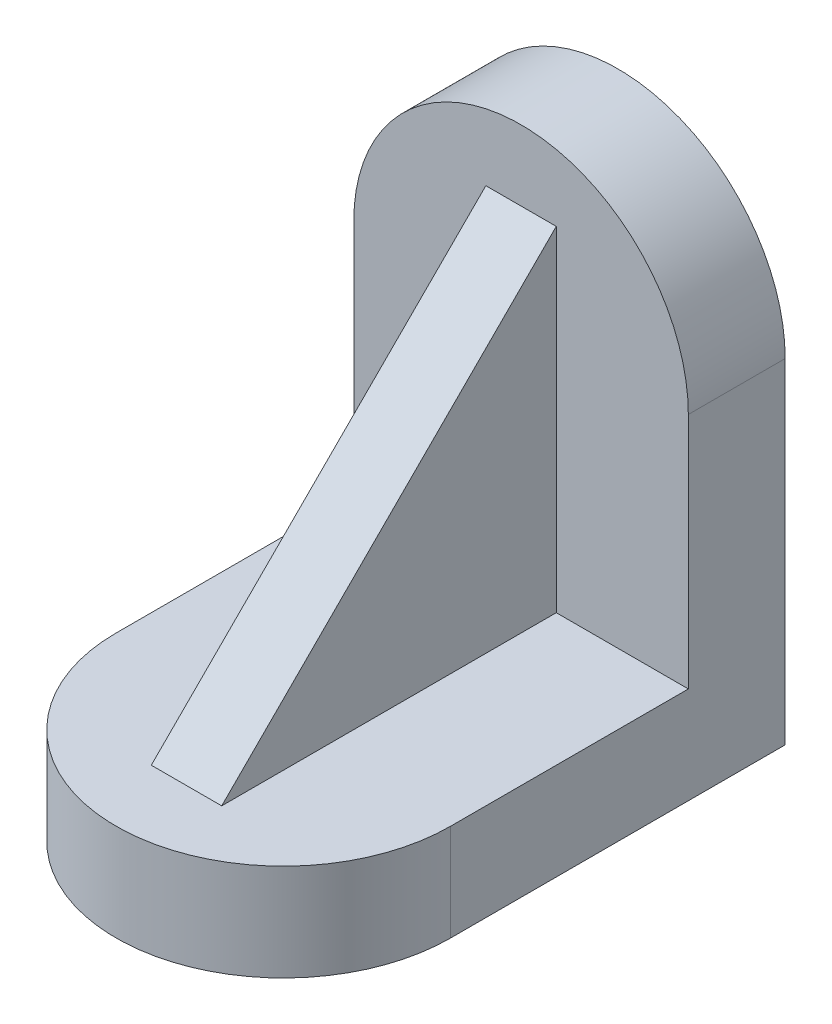
ISO-10303-21;
HEADER;
FILE_DESCRIPTION(('STEP AP214'),'2;1');
FILE_NAME('part.step','',(''),(''),'','','');
FILE_SCHEMA(('AUTOMOTIVE_DESIGN { 1 0 10303 214 1 1 1 1 }'));
ENDSEC;
DATA;
#1=APPLICATION_CONTEXT('core data for automotive mechanical design processes');
#2=APPLICATION_PROTOCOL_DEFINITION('international standard','automotive_design',2000,#1);
#3=PRODUCT_CONTEXT('',#1,'mechanical');
#4=PRODUCT('Part','Part','',(#3));
#5=PRODUCT_RELATED_PRODUCT_CATEGORY('part','',(#4));
#6=PRODUCT_DEFINITION_FORMATION('','',#4);
#7=PRODUCT_DEFINITION_CONTEXT('part definition',#1,'design');
#8=PRODUCT_DEFINITION('design','',#6,#7);
#9=PRODUCT_DEFINITION_SHAPE('','',#8);
#10=(LENGTH_UNIT() NAMED_UNIT(*) SI_UNIT(.MILLI.,.METRE.));
#11=(NAMED_UNIT(*) PLANE_ANGLE_UNIT() SI_UNIT($,.RADIAN.));
#12=(NAMED_UNIT(*) SI_UNIT($,.STERADIAN.) SOLID_ANGLE_UNIT());
#13=UNCERTAINTY_MEASURE_WITH_UNIT(LENGTH_MEASURE(1.E-05),#10,'distance_accuracy_value','');
#14=(GEOMETRIC_REPRESENTATION_CONTEXT(3) GLOBAL_UNCERTAINTY_ASSIGNED_CONTEXT((#13)) GLOBAL_UNIT_ASSIGNED_CONTEXT((#10,
#11,#12)) REPRESENTATION_CONTEXT('',''));
#15=CARTESIAN_POINT('',(0.,0.,0.));
#16=DIRECTION('',(0.,0.,1.));
#17=DIRECTION('',(1.,0.,0.));
#18=AXIS2_PLACEMENT_3D('',#15,#16,#17);
#19=CARTESIAN_POINT('',(19.,11.,0.));
#20=DIRECTION('',(0.,1.,0.));
#21=DIRECTION('',(0.,0.,1.));
#22=AXIS2_PLACEMENT_3D('',#19,#20,#21);
#23=PLANE('',#22);
#24=DIRECTION('',(0.,0.,1.));
#25=VECTOR('',#24,1.);
#26=CARTESIAN_POINT('',(15.,11.,0.));
#27=LINE('',#26,#25);
#28=CARTESIAN_POINT('',(15.,11.,-27.));
#29=VERTEX_POINT('',#28);
#30=CARTESIAN_POINT('',(15.,11.,11.));
#31=VERTEX_POINT('',#30);
#32=EDGE_CURVE('E125',#29,#31,#27,.T.);
#33=ORIENTED_EDGE('',*,*,#32,.F.);
#34=DIRECTION('',(-1.,0.,0.));
#35=VECTOR('',#34,1.);
#36=CARTESIAN_POINT('',(19.,11.,-27.));
#37=LINE('',#36,#35);
#38=CARTESIAN_POINT('',(0.,11.,-27.));
#39=VERTEX_POINT('',#38);
#40=EDGE_CURVE('E142',#29,#39,#37,.T.);
#41=ORIENTED_EDGE('',*,*,#40,.T.);
#42=DIRECTION('',(0.,0.,1.));
#43=VECTOR('',#42,1.);
#44=CARTESIAN_POINT('',(0.,11.,0.));
#45=LINE('',#44,#43);
#46=CARTESIAN_POINT('',(0.,11.,0.));
#47=VERTEX_POINT('',#46);
#48=EDGE_CURVE('E154',#39,#47,#45,.T.);
#49=ORIENTED_EDGE('',*,*,#48,.T.);
#50=CARTESIAN_POINT('',(19.,11.,0.));
#51=DIRECTION('',(0.,1.,0.));
#52=DIRECTION('',(0.,0.,1.));
#53=AXIS2_PLACEMENT_3D('',#50,#51,#52);
#54=CIRCLE('',#53,19.);
#55=CARTESIAN_POINT('',(38.,11.,0.));
#56=VERTEX_POINT('',#55);
#57=EDGE_CURVE('E148',#47,#56,#54,.T.);
#58=ORIENTED_EDGE('',*,*,#57,.T.);
#59=DIRECTION('',(0.,0.,-1.));
#60=VECTOR('',#59,1.);
#61=CARTESIAN_POINT('',(38.,11.,0.));
#62=LINE('',#61,#60);
#63=CARTESIAN_POINT('',(38.,11.,-27.));
#64=VERTEX_POINT('',#63);
#65=EDGE_CURVE('E151',#56,#64,#62,.T.);
#66=ORIENTED_EDGE('',*,*,#65,.T.);
#67=CARTESIAN_POINT('',(23.,11.,-27.));
#68=VERTEX_POINT('',#67);
#69=EDGE_CURVE('E145',#64,#68,#37,.T.);
#70=ORIENTED_EDGE('',*,*,#69,.T.);
#71=DIRECTION('',(0.,0.,1.));
#72=VECTOR('',#71,1.);
#73=CARTESIAN_POINT('',(23.,11.,0.));
#74=LINE('',#73,#72);
#75=CARTESIAN_POINT('',(23.,11.,11.));
#76=VERTEX_POINT('',#75);
#77=EDGE_CURVE('E55',#68,#76,#74,.T.);
#78=ORIENTED_EDGE('',*,*,#77,.T.);
#79=DIRECTION('',(-1.,0.,0.));
#80=VECTOR('',#79,1.);
#81=CARTESIAN_POINT('',(19.,11.,11.));
#82=LINE('',#81,#80);
#83=EDGE_CURVE('E50',#31,#76,#82,.F.);
#84=ORIENTED_EDGE('',*,*,#83,.F.);
#85=EDGE_LOOP('',(#33,#41,#49,#58,#66,#70,#78,#84));
#86=FACE_BOUND('',#85,.T.);
#87=ADVANCED_FACE('F35',(#86),#23,.T.);
#88=CARTESIAN_POINT('',(19.,11.,0.));
#89=DIRECTION('',(0.,-1.,0.));
#90=DIRECTION('',(0.,0.,-1.));
#91=AXIS2_PLACEMENT_3D('',#88,#89,#90);
#92=CYLINDRICAL_SURFACE('',#91,19.);
#93=CARTESIAN_POINT('',(19.,0.,0.));
#94=DIRECTION('',(0.,1.,0.));
#95=DIRECTION('',(0.,0.,1.));
#96=AXIS2_PLACEMENT_3D('',#93,#94,#95);
#97=CIRCLE('',#96,19.);
#98=CARTESIAN_POINT('',(0.,0.,0.));
#99=VERTEX_POINT('',#98);
#100=CARTESIAN_POINT('',(38.,0.,0.));
#101=VERTEX_POINT('',#100);
#102=EDGE_CURVE('E147',#99,#101,#97,.T.);
#103=ORIENTED_EDGE('',*,*,#102,.T.);
#104=DIRECTION('',(0.,-1.,0.));
#105=VECTOR('',#104,1.);
#106=CARTESIAN_POINT('',(38.,11.,0.));
#107=LINE('',#106,#105);
#108=EDGE_CURVE('E117',#56,#101,#107,.T.);
#109=ORIENTED_EDGE('',*,*,#108,.F.);
#110=ORIENTED_EDGE('',*,*,#57,.F.);
#111=DIRECTION('',(0.,-1.,0.));
#112=VECTOR('',#111,1.);
#113=CARTESIAN_POINT('',(0.,11.,0.));
#114=LINE('',#113,#112);
#115=EDGE_CURVE('E156',#47,#99,#114,.T.);
#116=ORIENTED_EDGE('',*,*,#115,.T.);
#117=EDGE_LOOP('',(#103,#109,#110,#116));
#118=FACE_BOUND('',#117,.T.);
#119=ADVANCED_FACE('F37',(#118),#92,.T.);
#120=CARTESIAN_POINT('',(38.,11.,0.));
#121=DIRECTION('',(-1.,0.,0.));
#122=DIRECTION('',(0.,0.,1.));
#123=AXIS2_PLACEMENT_3D('',#120,#121,#122);
#124=PLANE('',#123);
#125=DIRECTION('',(0.,-1.,0.));
#126=VECTOR('',#125,1.);
#127=CARTESIAN_POINT('',(38.,11.,-38.));
#128=LINE('',#127,#126);
#129=CARTESIAN_POINT('',(38.,38.,-38.));
#130=VERTEX_POINT('',#129);
#131=CARTESIAN_POINT('',(38.,0.,-38.));
#132=VERTEX_POINT('',#131);
#133=EDGE_CURVE('E168',#130,#132,#128,.T.);
#134=ORIENTED_EDGE('',*,*,#133,.F.);
#135=DIRECTION('',(0.,0.,-1.));
#136=VECTOR('',#135,1.);
#137=CARTESIAN_POINT('',(38.,38.,-27.));
#138=LINE('',#137,#136);
#139=CARTESIAN_POINT('',(38.,38.,-27.));
#140=VERTEX_POINT('',#139);
#141=EDGE_CURVE('E139',#140,#130,#138,.T.);
#142=ORIENTED_EDGE('',*,*,#141,.F.);
#143=DIRECTION('',(0.,-1.,0.));
#144=VECTOR('',#143,1.);
#145=CARTESIAN_POINT('',(38.,0.,-27.));
#146=LINE('',#145,#144);
#147=EDGE_CURVE('E129',#140,#64,#146,.T.);
#148=ORIENTED_EDGE('',*,*,#147,.T.);
#149=ORIENTED_EDGE('',*,*,#65,.F.);
#150=ORIENTED_EDGE('',*,*,#108,.T.);
#151=DIRECTION('',(0.,0.,-1.));
#152=VECTOR('',#151,1.);
#153=CARTESIAN_POINT('',(38.,0.,0.));
#154=LINE('',#153,#152);
#155=EDGE_CURVE('E158',#101,#132,#154,.T.);
#156=ORIENTED_EDGE('',*,*,#155,.T.);
#157=EDGE_LOOP('',(#134,#142,#148,#149,#150,#156));
#158=FACE_BOUND('',#157,.T.);
#159=ADVANCED_FACE('F175',(#158),#124,.F.);
#160=CARTESIAN_POINT('',(0.,11.,-38.));
#161=DIRECTION('',(0.,0.,1.));
#162=DIRECTION('',(1.,0.,0.));
#163=AXIS2_PLACEMENT_3D('',#160,#161,#162);
#164=PLANE('',#163);
#165=CARTESIAN_POINT('',(19.,38.,-38.));
#166=DIRECTION('',(0.,0.,-1.));
#167=DIRECTION('',(-1.,0.,0.));
#168=AXIS2_PLACEMENT_3D('',#165,#166,#167);
#169=CIRCLE('',#168,19.);
#170=CARTESIAN_POINT('',(0.,38.,-38.));
#171=VERTEX_POINT('',#170);
#172=EDGE_CURVE('E128',#171,#130,#169,.T.);
#173=ORIENTED_EDGE('',*,*,#172,.T.);
#174=ORIENTED_EDGE('',*,*,#133,.T.);
#175=DIRECTION('',(-1.,0.,0.));
#176=VECTOR('',#175,1.);
#177=CARTESIAN_POINT('',(0.,0.,-38.));
#178=LINE('',#177,#176);
#179=CARTESIAN_POINT('',(0.,0.,-38.));
#180=VERTEX_POINT('',#179);
#181=EDGE_CURVE('E160',#132,#180,#178,.T.);
#182=ORIENTED_EDGE('',*,*,#181,.T.);
#183=DIRECTION('',(0.,-1.,0.));
#184=VECTOR('',#183,1.);
#185=CARTESIAN_POINT('',(0.,11.,-38.));
#186=LINE('',#185,#184);
#187=EDGE_CURVE('E165',#171,#180,#186,.T.);
#188=ORIENTED_EDGE('',*,*,#187,.F.);
#189=EDGE_LOOP('',(#173,#174,#182,#188));
#190=FACE_BOUND('',#189,.T.);
#191=ADVANCED_FACE('F186',(#190),#164,.F.);
#192=CARTESIAN_POINT('',(0.,11.,0.));
#193=DIRECTION('',(1.,0.,0.));
#194=DIRECTION('',(0.,0.,-1.));
#195=AXIS2_PLACEMENT_3D('',#192,#193,#194);
#196=PLANE('',#195);
#197=DIRECTION('',(0.,0.,1.));
#198=VECTOR('',#197,1.);
#199=CARTESIAN_POINT('',(0.,0.,0.));
#200=LINE('',#199,#198);
#201=EDGE_CURVE('E152',#180,#99,#200,.T.);
#202=ORIENTED_EDGE('',*,*,#201,.T.);
#203=ORIENTED_EDGE('',*,*,#115,.F.);
#204=ORIENTED_EDGE('',*,*,#48,.F.);
#205=DIRECTION('',(0.,1.,0.));
#206=VECTOR('',#205,1.);
#207=CARTESIAN_POINT('',(0.,0.,-27.));
#208=LINE('',#207,#206);
#209=CARTESIAN_POINT('',(0.,38.,-27.));
#210=VERTEX_POINT('',#209);
#211=EDGE_CURVE('E132',#39,#210,#208,.T.);
#212=ORIENTED_EDGE('',*,*,#211,.T.);
#213=DIRECTION('',(0.,0.,-1.));
#214=VECTOR('',#213,1.);
#215=CARTESIAN_POINT('',(0.,38.,-27.));
#216=LINE('',#215,#214);
#217=EDGE_CURVE('E137',#210,#171,#216,.T.);
#218=ORIENTED_EDGE('',*,*,#217,.T.);
#219=ORIENTED_EDGE('',*,*,#187,.T.);
#220=EDGE_LOOP('',(#202,#203,#204,#212,#218,#219));
#221=FACE_BOUND('',#220,.T.);
#222=ADVANCED_FACE('F188',(#221),#196,.F.);
#223=CARTESIAN_POINT('',(19.,0.,0.));
#224=DIRECTION('',(0.,1.,0.));
#225=DIRECTION('',(0.,0.,1.));
#226=AXIS2_PLACEMENT_3D('',#223,#224,#225);
#227=PLANE('',#226);
#228=ORIENTED_EDGE('',*,*,#201,.F.);
#229=ORIENTED_EDGE('',*,*,#181,.F.);
#230=ORIENTED_EDGE('',*,*,#155,.F.);
#231=ORIENTED_EDGE('',*,*,#102,.F.);
#232=EDGE_LOOP('',(#228,#229,#230,#231));
#233=FACE_BOUND('',#232,.T.);
#234=ADVANCED_FACE('F184',(#233),#227,.F.);
#235=CARTESIAN_POINT('',(19.,38.,-27.));
#236=DIRECTION('',(0.,0.,-1.));
#237=DIRECTION('',(-1.,0.,0.));
#238=AXIS2_PLACEMENT_3D('',#235,#236,#237);
#239=CYLINDRICAL_SURFACE('',#238,19.);
#240=ORIENTED_EDGE('',*,*,#141,.T.);
#241=ORIENTED_EDGE('',*,*,#172,.F.);
#242=ORIENTED_EDGE('',*,*,#217,.F.);
#243=CARTESIAN_POINT('',(19.,38.,-27.));
#244=DIRECTION('',(0.,0.,-1.));
#245=DIRECTION('',(-1.,0.,0.));
#246=AXIS2_PLACEMENT_3D('',#243,#244,#245);
#247=CIRCLE('',#246,19.);
#248=EDGE_CURVE('E134',#210,#140,#247,.T.);
#249=ORIENTED_EDGE('',*,*,#248,.T.);
#250=EDGE_LOOP('',(#240,#241,#242,#249));
#251=FACE_BOUND('',#250,.T.);
#252=ADVANCED_FACE('F195',(#251),#239,.T.);
#253=CARTESIAN_POINT('',(19.,38.,-27.));
#254=DIRECTION('',(0.,0.,-1.));
#255=DIRECTION('',(-1.,0.,0.));
#256=AXIS2_PLACEMENT_3D('',#253,#254,#255);
#257=PLANE('',#256);
#258=ORIENTED_EDGE('',*,*,#40,.F.);
#259=DIRECTION('',(0.,1.,0.));
#260=VECTOR('',#259,1.);
#261=CARTESIAN_POINT('',(15.,38.,-27.));
#262=LINE('',#261,#260);
#263=CARTESIAN_POINT('',(15.,49.,-27.));
#264=VERTEX_POINT('',#263);
#265=EDGE_CURVE('E11',#29,#264,#262,.T.);
#266=ORIENTED_EDGE('',*,*,#265,.T.);
#267=DIRECTION('',(-1.,0.,0.));
#268=VECTOR('',#267,1.);
#269=CARTESIAN_POINT('',(19.,49.,-27.));
#270=LINE('',#269,#268);
#271=CARTESIAN_POINT('',(23.,49.,-27.));
#272=VERTEX_POINT('',#271);
#273=EDGE_CURVE('E43',#264,#272,#270,.F.);
#274=ORIENTED_EDGE('',*,*,#273,.T.);
#275=DIRECTION('',(0.,1.,0.));
#276=VECTOR('',#275,1.);
#277=CARTESIAN_POINT('',(23.,38.,-27.));
#278=LINE('',#277,#276);
#279=EDGE_CURVE('E107',#68,#272,#278,.T.);
#280=ORIENTED_EDGE('',*,*,#279,.F.);
#281=ORIENTED_EDGE('',*,*,#69,.F.);
#282=ORIENTED_EDGE('',*,*,#147,.F.);
#283=ORIENTED_EDGE('',*,*,#248,.F.);
#284=ORIENTED_EDGE('',*,*,#211,.F.);
#285=EDGE_LOOP('',(#258,#266,#274,#280,#281,#282,#283,#284));
#286=FACE_BOUND('',#285,.T.);
#287=ADVANCED_FACE('F105',(#286),#257,.F.);
#288=CARTESIAN_POINT('',(19.,49.,-27.));
#289=DIRECTION('',(0.,-0.707106781186548,-0.707106781186547));
#290=DIRECTION('',(0.,-0.707106781186548,0.707106781186548));
#291=AXIS2_PLACEMENT_3D('',#288,#289,#290);
#292=PLANE('',#291);
#293=DIRECTION('',(0.,-0.707106781186548,0.707106781186548));
#294=VECTOR('',#293,1.);
#295=CARTESIAN_POINT('',(15.,49.,-27.));
#296=LINE('',#295,#294);
#297=EDGE_CURVE('E120',#264,#31,#296,.T.);
#298=ORIENTED_EDGE('',*,*,#297,.T.);
#299=ORIENTED_EDGE('',*,*,#83,.T.);
#300=DIRECTION('',(0.,-0.707106781186548,0.707106781186548));
#301=VECTOR('',#300,1.);
#302=CARTESIAN_POINT('',(23.,49.,-27.));
#303=LINE('',#302,#301);
#304=EDGE_CURVE('E116',#272,#76,#303,.T.);
#305=ORIENTED_EDGE('',*,*,#304,.F.);
#306=ORIENTED_EDGE('',*,*,#273,.F.);
#307=EDGE_LOOP('',(#298,#299,#305,#306));
#308=FACE_BOUND('',#307,.T.);
#309=ADVANCED_FACE('F119',(#308),#292,.F.);
#310=CARTESIAN_POINT('',(15.,28.5,-9.5));
#311=DIRECTION('',(-1.,0.,0.));
#312=DIRECTION('',(0.,0.,1.));
#313=AXIS2_PLACEMENT_3D('',#310,#311,#312);
#314=PLANE('',#313);
#315=ORIENTED_EDGE('',*,*,#265,.F.);
#316=ORIENTED_EDGE('',*,*,#32,.T.);
#317=ORIENTED_EDGE('',*,*,#297,.F.);
#318=EDGE_LOOP('',(#315,#316,#317));
#319=FACE_BOUND('',#318,.T.);
#320=ADVANCED_FACE('F198',(#319),#314,.T.);
#321=CARTESIAN_POINT('',(23.,28.5,-9.5));
#322=DIRECTION('',(-1.,0.,0.));
#323=DIRECTION('',(0.,0.,1.));
#324=AXIS2_PLACEMENT_3D('',#321,#322,#323);
#325=PLANE('',#324);
#326=ORIENTED_EDGE('',*,*,#77,.F.);
#327=ORIENTED_EDGE('',*,*,#279,.T.);
#328=ORIENTED_EDGE('',*,*,#304,.T.);
#329=EDGE_LOOP('',(#326,#327,#328));
#330=FACE_BOUND('',#329,.T.);
#331=ADVANCED_FACE('F115',(#330),#325,.F.);
#332=CLOSED_SHELL('',(#87,#119,#159,#191,#222,#234,#252,#287,#309,#320,#331));
#333=MANIFOLD_SOLID_BREP('B2',#332);
#334=ADVANCED_BREP_SHAPE_REPRESENTATION('',(#18,#333),#14);
#335=SHAPE_DEFINITION_REPRESENTATION(#9,#334);
ENDSEC;
END-ISO-10303-21;
